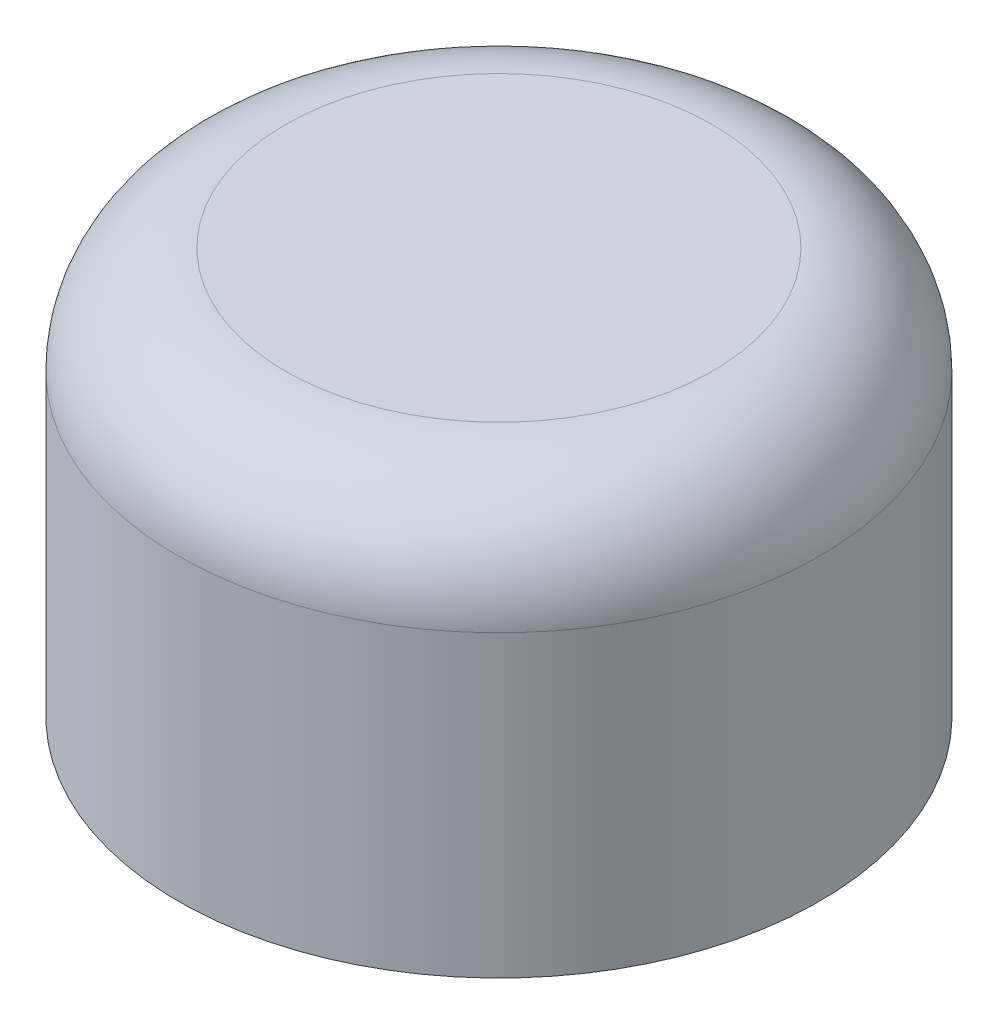
ISO-10303-21;
HEADER;
FILE_DESCRIPTION(('STEP AP214'),'2;1');
FILE_NAME('part.step','',(''),(''),'','','');
FILE_SCHEMA(('AUTOMOTIVE_DESIGN { 1 0 10303 214 1 1 1 1 }'));
ENDSEC;
DATA;
#1=APPLICATION_CONTEXT('core data for automotive mechanical design processes');
#2=APPLICATION_PROTOCOL_DEFINITION('international standard','automotive_design',2000,#1);
#3=PRODUCT_CONTEXT('',#1,'mechanical');
#4=PRODUCT('Part','Part','',(#3));
#5=PRODUCT_RELATED_PRODUCT_CATEGORY('part','',(#4));
#6=PRODUCT_DEFINITION_FORMATION('','',#4);
#7=PRODUCT_DEFINITION_CONTEXT('part definition',#1,'design');
#8=PRODUCT_DEFINITION('design','',#6,#7);
#9=PRODUCT_DEFINITION_SHAPE('','',#8);
#10=(LENGTH_UNIT() NAMED_UNIT(*) SI_UNIT(.MILLI.,.METRE.));
#11=(NAMED_UNIT(*) PLANE_ANGLE_UNIT() SI_UNIT($,.RADIAN.));
#12=(NAMED_UNIT(*) SI_UNIT($,.STERADIAN.) SOLID_ANGLE_UNIT());
#13=UNCERTAINTY_MEASURE_WITH_UNIT(LENGTH_MEASURE(1.E-05),#10,'distance_accuracy_value','');
#14=(GEOMETRIC_REPRESENTATION_CONTEXT(3) GLOBAL_UNCERTAINTY_ASSIGNED_CONTEXT((#13)) GLOBAL_UNIT_ASSIGNED_CONTEXT((#10,
#11,#12)) REPRESENTATION_CONTEXT('',''));
#15=CARTESIAN_POINT('',(0.,0.,0.));
#16=DIRECTION('',(0.,0.,1.));
#17=DIRECTION('',(1.,0.,0.));
#18=AXIS2_PLACEMENT_3D('',#15,#16,#17);
#19=CARTESIAN_POINT('',(0.,20.,0.));
#20=DIRECTION('',(0.,1.,0.));
#21=DIRECTION('',(0.,0.,1.));
#22=AXIS2_PLACEMENT_3D('',#19,#20,#21);
#23=PLANE('',#22);
#24=CARTESIAN_POINT('',(0.,20.,0.));
#25=DIRECTION('',(0.,-1.,0.));
#26=DIRECTION('',(0.,0.,-1.));
#27=AXIS2_PLACEMENT_3D('',#24,#25,#26);
#28=CIRCLE('',#27,10.);
#29=CARTESIAN_POINT('',(0.,20.,-10.));
#30=VERTEX_POINT('',#29);
#31=EDGE_CURVE('E44',#30,#30,#28,.T.);
#32=ORIENTED_EDGE('',*,*,#31,.F.);
#33=EDGE_LOOP('',(#32));
#34=FACE_BOUND('',#33,.T.);
#35=ADVANCED_FACE('F32',(#34),#23,.T.);
#36=CARTESIAN_POINT('',(0.,15.,0.));
#37=DIRECTION('',(0.,-1.,0.));
#38=DIRECTION('',(0.,0.,-1.));
#39=AXIS2_PLACEMENT_3D('',#36,#37,#38);
#40=TOROIDAL_SURFACE('',#39,10.,5.);
#41=ORIENTED_EDGE('',*,*,#31,.T.);
#42=EDGE_LOOP('',(#41));
#43=FACE_BOUND('',#42,.T.);
#44=CARTESIAN_POINT('',(0.,15.,0.));
#45=DIRECTION('',(0.,-1.,0.));
#46=DIRECTION('',(0.,0.,-1.));
#47=AXIS2_PLACEMENT_3D('',#44,#45,#46);
#48=CIRCLE('',#47,15.);
#49=CARTESIAN_POINT('',(0.,15.,-15.));
#50=VERTEX_POINT('',#49);
#51=EDGE_CURVE('E48',#50,#50,#48,.T.);
#52=ORIENTED_EDGE('',*,*,#51,.F.);
#53=EDGE_LOOP('',(#52));
#54=FACE_BOUND('',#53,.T.);
#55=ADVANCED_FACE('F90',(#43,#54),#40,.T.);
#56=CARTESIAN_POINT('',(0.,3.5,0.));
#57=DIRECTION('',(0.,-1.,0.));
#58=DIRECTION('',(0.,0.,-1.));
#59=AXIS2_PLACEMENT_3D('',#56,#57,#58);
#60=CYLINDRICAL_SURFACE('',#59,15.);
#61=ORIENTED_EDGE('',*,*,#51,.T.);
#62=EDGE_LOOP('',(#61));
#63=FACE_BOUND('',#62,.T.);
#64=CARTESIAN_POINT('',(0.,1.,0.));
#65=DIRECTION('',(0.,-1.,0.));
#66=DIRECTION('',(0.,0.,-1.));
#67=AXIS2_PLACEMENT_3D('',#64,#65,#66);
#68=CIRCLE('',#67,15.);
#69=CARTESIAN_POINT('',(0.,1.,-15.));
#70=VERTEX_POINT('',#69);
#71=EDGE_CURVE('E53',#70,#70,#68,.T.);
#72=ORIENTED_EDGE('',*,*,#71,.F.);
#73=EDGE_LOOP('',(#72));
#74=FACE_BOUND('',#73,.T.);
#75=ADVANCED_FACE('F94',(#63,#74),#60,.T.);
#76=CARTESIAN_POINT('',(15.,1.,0.));
#77=DIRECTION('',(0.,-1.,0.));
#78=DIRECTION('',(0.,0.,-1.));
#79=AXIS2_PLACEMENT_3D('',#76,#77,#78);
#80=PLANE('',#79);
#81=ORIENTED_EDGE('',*,*,#71,.T.);
#82=EDGE_LOOP('',(#81));
#83=FACE_BOUND('',#82,.T.);
#84=CARTESIAN_POINT('',(0.,1.,0.));
#85=DIRECTION('',(0.,-1.,0.));
#86=DIRECTION('',(0.,0.,-1.));
#87=AXIS2_PLACEMENT_3D('',#84,#85,#86);
#88=CIRCLE('',#87,13.);
#89=CARTESIAN_POINT('',(0.,1.,-13.));
#90=VERTEX_POINT('',#89);
#91=EDGE_CURVE('E56',#90,#90,#88,.T.);
#92=ORIENTED_EDGE('',*,*,#91,.F.);
#93=EDGE_LOOP('',(#92));
#94=FACE_BOUND('',#93,.T.);
#95=ADVANCED_FACE('F98',(#83,#94),#80,.T.);
#96=CARTESIAN_POINT('',(0.,3.5,0.));
#97=DIRECTION('',(0.,-1.,0.));
#98=DIRECTION('',(0.,0.,-1.));
#99=AXIS2_PLACEMENT_3D('',#96,#97,#98);
#100=CYLINDRICAL_SURFACE('',#99,13.);
#101=ORIENTED_EDGE('',*,*,#91,.T.);
#102=EDGE_LOOP('',(#101));
#103=FACE_BOUND('',#102,.T.);
#104=CARTESIAN_POINT('',(0.,3.5,0.));
#105=DIRECTION('',(0.,-1.,0.));
#106=DIRECTION('',(0.,0.,-1.));
#107=AXIS2_PLACEMENT_3D('',#104,#105,#106);
#108=CIRCLE('',#107,13.);
#109=CARTESIAN_POINT('',(0.,3.5,-13.));
#110=VERTEX_POINT('',#109);
#111=EDGE_CURVE('E59',#110,#110,#108,.T.);
#112=ORIENTED_EDGE('',*,*,#111,.F.);
#113=EDGE_LOOP('',(#112));
#114=FACE_BOUND('',#113,.T.);
#115=ADVANCED_FACE('F102',(#103,#114),#100,.F.);
#116=CARTESIAN_POINT('',(13.,3.5,0.));
#117=DIRECTION('',(0.,-1.,0.));
#118=DIRECTION('',(0.,0.,-1.));
#119=AXIS2_PLACEMENT_3D('',#116,#117,#118);
#120=PLANE('',#119);
#121=ORIENTED_EDGE('',*,*,#111,.T.);
#122=EDGE_LOOP('',(#121));
#123=FACE_BOUND('',#122,.T.);
#124=ADVANCED_FACE('F105',(#123),#120,.T.);
#125=CLOSED_SHELL('',(#35,#55,#75,#95,#115,#124));
#126=CARTESIAN_POINT('',(0.,3.5,0.));
#127=DIRECTION('',(0.,-1.,0.));
#128=DIRECTION('',(0.,0.,-1.));
#129=AXIS2_PLACEMENT_3D('',#126,#127,#128);
#130=CYLINDRICAL_SURFACE('',#129,13.);
#131=CARTESIAN_POINT('',(0.,6.5,0.));
#132=DIRECTION('',(0.,-1.,0.));
#133=DIRECTION('',(0.,0.,-1.));
#134=AXIS2_PLACEMENT_3D('',#131,#132,#133);
#135=CIRCLE('',#134,13.);
#136=CARTESIAN_POINT('',(0.,6.5,-13.));
#137=VERTEX_POINT('',#136);
#138=EDGE_CURVE('E62',#137,#137,#135,.T.);
#139=ORIENTED_EDGE('',*,*,#138,.T.);
#140=EDGE_LOOP('',(#139));
#141=FACE_BOUND('',#140,.T.);
#142=CARTESIAN_POINT('',(0.,15.,0.));
#143=DIRECTION('',(0.,-1.,0.));
#144=DIRECTION('',(0.,0.,-1.));
#145=AXIS2_PLACEMENT_3D('',#142,#143,#144);
#146=CIRCLE('',#145,13.);
#147=CARTESIAN_POINT('',(0.,15.,-13.));
#148=VERTEX_POINT('',#147);
#149=EDGE_CURVE('E10',#148,#148,#146,.T.);
#150=ORIENTED_EDGE('',*,*,#149,.F.);
#151=EDGE_LOOP('',(#150));
#152=FACE_BOUND('',#151,.T.);
#153=ADVANCED_FACE('F34',(#141,#152),#130,.F.);
#154=CARTESIAN_POINT('',(0.,15.,0.));
#155=DIRECTION('',(0.,-1.,0.));
#156=DIRECTION('',(0.,0.,-1.));
#157=AXIS2_PLACEMENT_3D('',#154,#155,#156);
#158=TOROIDAL_SURFACE('',#157,10.,3.);
#159=ORIENTED_EDGE('',*,*,#149,.T.);
#160=EDGE_LOOP('',(#159));
#161=FACE_BOUND('',#160,.T.);
#162=CARTESIAN_POINT('',(0.,18.,0.));
#163=DIRECTION('',(0.,-1.,0.));
#164=DIRECTION('',(0.,0.,-1.));
#165=AXIS2_PLACEMENT_3D('',#162,#163,#164);
#166=CIRCLE('',#165,10.);
#167=CARTESIAN_POINT('',(0.,18.,-10.));
#168=VERTEX_POINT('',#167);
#169=EDGE_CURVE('E40',#168,#168,#166,.T.);
#170=ORIENTED_EDGE('',*,*,#169,.F.);
#171=EDGE_LOOP('',(#170));
#172=FACE_BOUND('',#171,.T.);
#173=ADVANCED_FACE('F76',(#161,#172),#158,.F.);
#174=CARTESIAN_POINT('',(0.,18.,0.));
#175=DIRECTION('',(0.,-1.,0.));
#176=DIRECTION('',(0.,0.,-1.));
#177=AXIS2_PLACEMENT_3D('',#174,#175,#176);
#178=PLANE('',#177);
#179=ORIENTED_EDGE('',*,*,#169,.T.);
#180=EDGE_LOOP('',(#179));
#181=FACE_BOUND('',#180,.T.);
#182=ADVANCED_FACE('F70',(#181),#178,.T.);
#183=CARTESIAN_POINT('',(0.,6.5,0.));
#184=DIRECTION('',(0.,1.,0.));
#185=DIRECTION('',(0.,0.,1.));
#186=AXIS2_PLACEMENT_3D('',#183,#184,#185);
#187=PLANE('',#186);
#188=ORIENTED_EDGE('',*,*,#138,.F.);
#189=EDGE_LOOP('',(#188));
#190=FACE_BOUND('',#189,.T.);
#191=ADVANCED_FACE('F68',(#190),#187,.T.);
#192=CLOSED_SHELL('',(#153,#173,#182,#191));
#193=ORIENTED_CLOSED_SHELL('',*,#192,.T.);
#194=BREP_WITH_VOIDS('B2',#125,(#193));
#195=ADVANCED_BREP_SHAPE_REPRESENTATION('',(#18,#194),#14);
#196=SHAPE_DEFINITION_REPRESENTATION(#9,#195);
ENDSEC;
END-ISO-10303-21;
